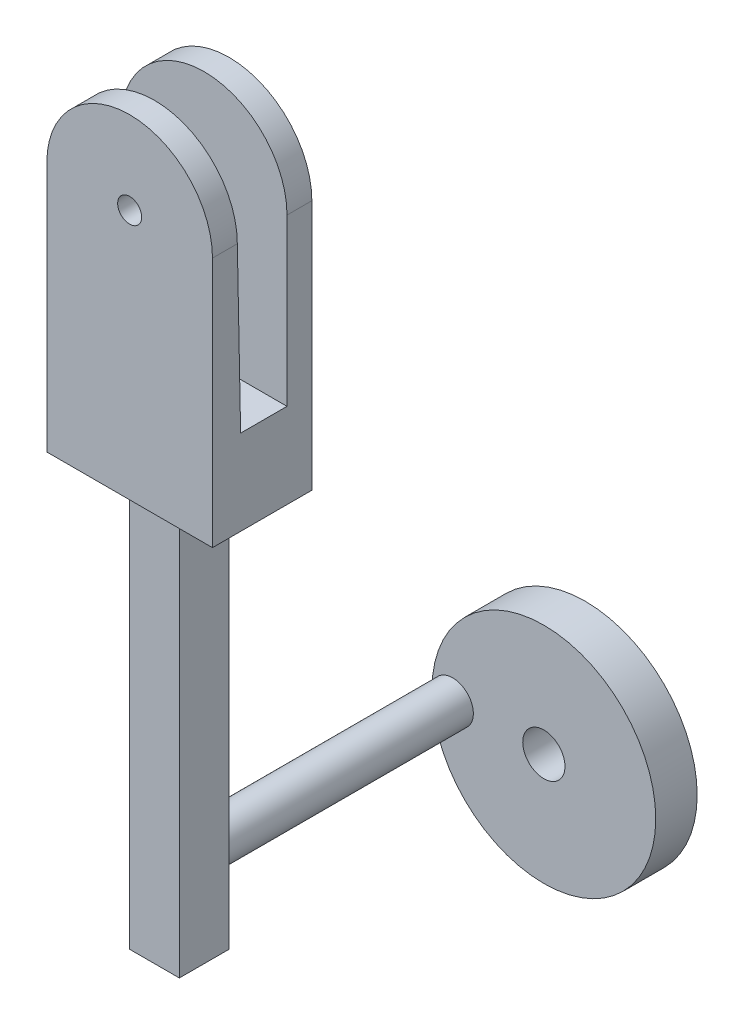
ISO-10303-21;
HEADER;
FILE_DESCRIPTION(('STEP AP214'),'2;1');
FILE_NAME('part.step','',(''),(''),'','','');
FILE_SCHEMA(('AUTOMOTIVE_DESIGN { 1 0 10303 214 1 1 1 1 }'));
ENDSEC;
DATA;
#1=APPLICATION_CONTEXT('core data for automotive mechanical design processes');
#2=APPLICATION_PROTOCOL_DEFINITION('international standard','automotive_design',2000,#1);
#3=PRODUCT_CONTEXT('',#1,'mechanical');
#4=PRODUCT('Part','Part','',(#3));
#5=PRODUCT_RELATED_PRODUCT_CATEGORY('part','',(#4));
#6=PRODUCT_DEFINITION_FORMATION('','',#4);
#7=PRODUCT_DEFINITION_CONTEXT('part definition',#1,'design');
#8=PRODUCT_DEFINITION('design','',#6,#7);
#9=PRODUCT_DEFINITION_SHAPE('','',#8);
#10=(LENGTH_UNIT() NAMED_UNIT(*) SI_UNIT(.MILLI.,.METRE.));
#11=(NAMED_UNIT(*) PLANE_ANGLE_UNIT() SI_UNIT($,.RADIAN.));
#12=(NAMED_UNIT(*) SI_UNIT($,.STERADIAN.) SOLID_ANGLE_UNIT());
#13=UNCERTAINTY_MEASURE_WITH_UNIT(LENGTH_MEASURE(1.E-05),#10,'distance_accuracy_value','');
#14=(GEOMETRIC_REPRESENTATION_CONTEXT(3) GLOBAL_UNCERTAINTY_ASSIGNED_CONTEXT((#13)) GLOBAL_UNIT_ASSIGNED_CONTEXT((#10,
#11,#12)) REPRESENTATION_CONTEXT('',''));
#15=CARTESIAN_POINT('',(0.,0.,0.));
#16=DIRECTION('',(0.,0.,1.));
#17=DIRECTION('',(1.,0.,0.));
#18=AXIS2_PLACEMENT_3D('',#15,#16,#17);
#19=CARTESIAN_POINT('',(0.,-30.2764175480678,12.));
#20=DIRECTION('',(0.,1.,0.));
#21=DIRECTION('',(0.,0.,1.));
#22=AXIS2_PLACEMENT_3D('',#19,#20,#21);
#23=PLANE('',#22);
#24=DIRECTION('',(1.,0.,0.));
#25=VECTOR('',#24,1.);
#26=CARTESIAN_POINT('',(0.,-30.2764175480678,0.));
#27=LINE('',#26,#25);
#28=CARTESIAN_POINT('',(-10.,-30.2764175480678,0.));
#29=VERTEX_POINT('',#28);
#30=CARTESIAN_POINT('',(10.,-30.2764175480678,0.));
#31=VERTEX_POINT('',#30);
#32=EDGE_CURVE('E212',#29,#31,#27,.T.);
#33=ORIENTED_EDGE('',*,*,#32,.T.);
#34=DIRECTION('',(0.,0.,-1.));
#35=VECTOR('',#34,1.);
#36=CARTESIAN_POINT('',(10.,-30.2764175480678,12.));
#37=LINE('',#36,#35);
#38=CARTESIAN_POINT('',(10.,-30.2764175480678,12.));
#39=VERTEX_POINT('',#38);
#40=EDGE_CURVE('E221',#39,#31,#37,.T.);
#41=ORIENTED_EDGE('',*,*,#40,.F.);
#42=DIRECTION('',(1.,0.,0.));
#43=VECTOR('',#42,1.);
#44=CARTESIAN_POINT('',(0.,-30.2764175480678,12.));
#45=LINE('',#44,#43);
#46=CARTESIAN_POINT('',(-10.,-30.2764175480678,12.));
#47=VERTEX_POINT('',#46);
#48=EDGE_CURVE('E219',#47,#39,#45,.T.);
#49=ORIENTED_EDGE('',*,*,#48,.F.);
#50=DIRECTION('',(0.,0.,-1.));
#51=VECTOR('',#50,1.);
#52=CARTESIAN_POINT('',(-10.,-30.2764175480678,12.));
#53=LINE('',#52,#51);
#54=EDGE_CURVE('E235',#47,#29,#53,.T.);
#55=ORIENTED_EDGE('',*,*,#54,.T.);
#56=EDGE_LOOP('',(#33,#41,#49,#55));
#57=FACE_BOUND('',#56,.T.);
#58=DIRECTION('',(-1.,0.,0.));
#59=VECTOR('',#58,1.);
#60=CARTESIAN_POINT('',(3.,-30.2764175480678,9.));
#61=LINE('',#60,#59);
#62=CARTESIAN_POINT('',(3.,-30.2764175480678,9.));
#63=VERTEX_POINT('',#62);
#64=CARTESIAN_POINT('',(-3.,-30.2764175480678,9.));
#65=VERTEX_POINT('',#64);
#66=EDGE_CURVE('E53',#63,#65,#61,.T.);
#67=ORIENTED_EDGE('',*,*,#66,.F.);
#68=DIRECTION('',(0.,0.,-1.));
#69=VECTOR('',#68,1.);
#70=CARTESIAN_POINT('',(3.,-30.2764175480678,9.));
#71=LINE('',#70,#69);
#72=CARTESIAN_POINT('',(3.,-30.2764175480678,3.));
#73=VERTEX_POINT('',#72);
#74=EDGE_CURVE('E58',#63,#73,#71,.T.);
#75=ORIENTED_EDGE('',*,*,#74,.T.);
#76=DIRECTION('',(-1.,0.,0.));
#77=VECTOR('',#76,1.);
#78=CARTESIAN_POINT('',(3.,-30.2764175480678,3.));
#79=LINE('',#78,#77);
#80=CARTESIAN_POINT('',(-3.,-30.2764175480678,3.));
#81=VERTEX_POINT('',#80);
#82=EDGE_CURVE('E165',#73,#81,#79,.T.);
#83=ORIENTED_EDGE('',*,*,#82,.T.);
#84=DIRECTION('',(0.,0.,-1.));
#85=VECTOR('',#84,1.);
#86=CARTESIAN_POINT('',(-3.,-30.2764175480678,9.));
#87=LINE('',#86,#85);
#88=EDGE_CURVE('E142',#65,#81,#87,.T.);
#89=ORIENTED_EDGE('',*,*,#88,.F.);
#90=EDGE_LOOP('',(#67,#75,#83,#89));
#91=FACE_BOUND('',#90,.T.);
#92=ADVANCED_FACE('F36',(#57,#91),#23,.F.);
#93=CARTESIAN_POINT('',(10.,0.,12.));
#94=DIRECTION('',(-1.,0.,0.));
#95=DIRECTION('',(0.,-1.,0.));
#96=AXIS2_PLACEMENT_3D('',#93,#94,#95);
#97=PLANE('',#96);
#98=DIRECTION('',(0.,-1.,0.));
#99=VECTOR('',#98,1.);
#100=CARTESIAN_POINT('',(10.,0.,3.));
#101=LINE('',#100,#99);
#102=CARTESIAN_POINT('',(10.,0.,3.));
#103=VERTEX_POINT('',#102);
#104=CARTESIAN_POINT('',(10.,-20.,3.));
#105=VERTEX_POINT('',#104);
#106=EDGE_CURVE('E177',#103,#105,#101,.T.);
#107=ORIENTED_EDGE('',*,*,#106,.T.);
#108=DIRECTION('',(0.,0.,-1.));
#109=VECTOR('',#108,1.);
#110=CARTESIAN_POINT('',(10.,-20.,0.));
#111=LINE('',#110,#109);
#112=CARTESIAN_POINT('',(10.,-20.,8.60053372982809));
#113=VERTEX_POINT('',#112);
#114=EDGE_CURVE('E181',#113,#105,#111,.T.);
#115=ORIENTED_EDGE('',*,*,#114,.F.);
#116=DIRECTION('',(0.,-0.999800593034313,-0.0199693306907542));
#117=VECTOR('',#116,1.);
#118=CARTESIAN_POINT('',(10.,-0.179688138004029,8.99641103248587));
#119=LINE('',#118,#117);
#120=CARTESIAN_POINT('',(10.,0.,9.));
#121=VERTEX_POINT('',#120);
#122=EDGE_CURVE('E190',#121,#113,#119,.T.);
#123=ORIENTED_EDGE('',*,*,#122,.F.);
#124=DIRECTION('',(0.,0.,-1.));
#125=VECTOR('',#124,1.);
#126=CARTESIAN_POINT('',(10.,0.,12.));
#127=LINE('',#126,#125);
#128=CARTESIAN_POINT('',(10.,0.,12.));
#129=VERTEX_POINT('',#128);
#130=EDGE_CURVE('E243',#129,#121,#127,.T.);
#131=ORIENTED_EDGE('',*,*,#130,.F.);
#132=DIRECTION('',(0.,1.,0.));
#133=VECTOR('',#132,1.);
#134=CARTESIAN_POINT('',(10.,0.,12.));
#135=LINE('',#134,#133);
#136=EDGE_CURVE('E211',#39,#129,#135,.T.);
#137=ORIENTED_EDGE('',*,*,#136,.F.);
#138=ORIENTED_EDGE('',*,*,#40,.T.);
#139=DIRECTION('',(0.,1.,0.));
#140=VECTOR('',#139,1.);
#141=CARTESIAN_POINT('',(10.,0.,0.));
#142=LINE('',#141,#140);
#143=CARTESIAN_POINT('',(10.,0.,0.));
#144=VERTEX_POINT('',#143);
#145=EDGE_CURVE('E224',#31,#144,#142,.T.);
#146=ORIENTED_EDGE('',*,*,#145,.T.);
#147=EDGE_CURVE('E242',#103,#144,#127,.T.);
#148=ORIENTED_EDGE('',*,*,#147,.F.);
#149=EDGE_LOOP('',(#107,#115,#123,#131,#137,#138,#146,#148));
#150=FACE_BOUND('',#149,.T.);
#151=ADVANCED_FACE('F295',(#150),#97,.F.);
#152=CARTESIAN_POINT('',(0.,0.,12.));
#153=DIRECTION('',(0.,0.,-1.));
#154=DIRECTION('',(-1.,0.,0.));
#155=AXIS2_PLACEMENT_3D('',#152,#153,#154);
#156=CYLINDRICAL_SURFACE('',#155,10.);
#157=CARTESIAN_POINT('',(0.,0.,3.));
#158=DIRECTION('',(0.,0.,1.));
#159=DIRECTION('',(1.,0.,0.));
#160=AXIS2_PLACEMENT_3D('',#157,#158,#159);
#161=CIRCLE('',#160,10.);
#162=CARTESIAN_POINT('',(-10.,0.,3.));
#163=VERTEX_POINT('',#162);
#164=EDGE_CURVE('E205',#103,#163,#161,.T.);
#165=ORIENTED_EDGE('',*,*,#164,.F.);
#166=ORIENTED_EDGE('',*,*,#147,.T.);
#167=CARTESIAN_POINT('',(0.,0.,0.));
#168=DIRECTION('',(0.,0.,1.));
#169=DIRECTION('',(1.,0.,0.));
#170=AXIS2_PLACEMENT_3D('',#167,#168,#169);
#171=CIRCLE('',#170,10.);
#172=CARTESIAN_POINT('',(-10.,0.,0.));
#173=VERTEX_POINT('',#172);
#174=EDGE_CURVE('E227',#144,#173,#171,.T.);
#175=ORIENTED_EDGE('',*,*,#174,.T.);
#176=DIRECTION('',(0.,0.,-1.));
#177=VECTOR('',#176,1.);
#178=CARTESIAN_POINT('',(-10.,0.,12.));
#179=LINE('',#178,#177);
#180=EDGE_CURVE('E238',#163,#173,#179,.T.);
#181=ORIENTED_EDGE('',*,*,#180,.F.);
#182=EDGE_LOOP('',(#165,#166,#175,#181));
#183=FACE_BOUND('',#182,.T.);
#184=ADVANCED_FACE('F266',(#183),#156,.T.);
#185=CARTESIAN_POINT('',(0.,0.,9.));
#186=DIRECTION('',(0.,0.,-1.));
#187=DIRECTION('',(-1.,0.,0.));
#188=AXIS2_PLACEMENT_3D('',#185,#186,#187);
#189=CIRCLE('',#188,10.);
#190=CARTESIAN_POINT('',(-10.,0.,9.));
#191=VERTEX_POINT('',#190);
#192=EDGE_CURVE('E197',#191,#121,#189,.T.);
#193=ORIENTED_EDGE('',*,*,#192,.F.);
#194=CARTESIAN_POINT('',(-10.,0.,12.));
#195=VERTEX_POINT('',#194);
#196=EDGE_CURVE('E239',#195,#191,#179,.T.);
#197=ORIENTED_EDGE('',*,*,#196,.F.);
#198=CARTESIAN_POINT('',(0.,0.,12.));
#199=DIRECTION('',(0.,0.,1.));
#200=DIRECTION('',(1.,0.,0.));
#201=AXIS2_PLACEMENT_3D('',#198,#199,#200);
#202=CIRCLE('',#201,10.);
#203=EDGE_CURVE('E215',#129,#195,#202,.T.);
#204=ORIENTED_EDGE('',*,*,#203,.F.);
#205=ORIENTED_EDGE('',*,*,#130,.T.);
#206=EDGE_LOOP('',(#193,#197,#204,#205));
#207=FACE_BOUND('',#206,.T.);
#208=ADVANCED_FACE('F285',(#207),#156,.T.);
#209=CARTESIAN_POINT('',(-10.,0.,12.));
#210=DIRECTION('',(1.,0.,0.));
#211=DIRECTION('',(0.,1.,0.));
#212=AXIS2_PLACEMENT_3D('',#209,#210,#211);
#213=PLANE('',#212);
#214=DIRECTION('',(0.,-1.,0.));
#215=VECTOR('',#214,1.);
#216=CARTESIAN_POINT('',(-10.,0.,3.));
#217=LINE('',#216,#215);
#218=CARTESIAN_POINT('',(-10.,-20.,3.));
#219=VERTEX_POINT('',#218);
#220=EDGE_CURVE('E178',#163,#219,#217,.T.);
#221=ORIENTED_EDGE('',*,*,#220,.F.);
#222=ORIENTED_EDGE('',*,*,#180,.T.);
#223=DIRECTION('',(0.,-1.,0.));
#224=VECTOR('',#223,1.);
#225=CARTESIAN_POINT('',(-10.,0.,0.));
#226=LINE('',#225,#224);
#227=EDGE_CURVE('E230',#173,#29,#226,.T.);
#228=ORIENTED_EDGE('',*,*,#227,.T.);
#229=ORIENTED_EDGE('',*,*,#54,.F.);
#230=DIRECTION('',(0.,-1.,0.));
#231=VECTOR('',#230,1.);
#232=CARTESIAN_POINT('',(-10.,0.,12.));
#233=LINE('',#232,#231);
#234=EDGE_CURVE('E217',#195,#47,#233,.T.);
#235=ORIENTED_EDGE('',*,*,#234,.F.);
#236=ORIENTED_EDGE('',*,*,#196,.T.);
#237=DIRECTION('',(0.,-0.999800593034313,-0.0199693306907542));
#238=VECTOR('',#237,1.);
#239=CARTESIAN_POINT('',(-10.,-0.179688138004029,8.99641103248587));
#240=LINE('',#239,#238);
#241=CARTESIAN_POINT('',(-10.,-20.,8.60053372982809));
#242=VERTEX_POINT('',#241);
#243=EDGE_CURVE('E180',#191,#242,#240,.T.);
#244=ORIENTED_EDGE('',*,*,#243,.T.);
#245=DIRECTION('',(0.,0.,-1.));
#246=VECTOR('',#245,1.);
#247=CARTESIAN_POINT('',(-10.,-20.,0.));
#248=LINE('',#247,#246);
#249=EDGE_CURVE('E184',#242,#219,#248,.T.);
#250=ORIENTED_EDGE('',*,*,#249,.T.);
#251=EDGE_LOOP('',(#221,#222,#228,#229,#235,#236,#244,#250));
#252=FACE_BOUND('',#251,.T.);
#253=ADVANCED_FACE('F265',(#252),#213,.F.);
#254=CARTESIAN_POINT('',(0.,0.,12.));
#255=DIRECTION('',(0.,0.,-1.));
#256=DIRECTION('',(-1.,0.,0.));
#257=AXIS2_PLACEMENT_3D('',#254,#255,#256);
#258=CYLINDRICAL_SURFACE('',#257,1.45);
#259=CARTESIAN_POINT('',(0.,0.,0.));
#260=DIRECTION('',(0.,0.,1.));
#261=DIRECTION('',(1.,0.,0.));
#262=AXIS2_PLACEMENT_3D('',#259,#260,#261);
#263=CIRCLE('',#262,1.45);
#264=CARTESIAN_POINT('',(1.45,0.,0.));
#265=VERTEX_POINT('',#264);
#266=EDGE_CURVE('E207',#265,#265,#263,.T.);
#267=ORIENTED_EDGE('',*,*,#266,.F.);
#268=EDGE_LOOP('',(#267));
#269=FACE_BOUND('',#268,.T.);
#270=CARTESIAN_POINT('',(0.,0.,3.));
#271=DIRECTION('',(0.,0.,1.));
#272=DIRECTION('',(1.,0.,0.));
#273=AXIS2_PLACEMENT_3D('',#270,#271,#272);
#274=CIRCLE('',#273,1.45);
#275=CARTESIAN_POINT('',(1.45,0.,3.));
#276=VERTEX_POINT('',#275);
#277=EDGE_CURVE('E204',#276,#276,#274,.T.);
#278=ORIENTED_EDGE('',*,*,#277,.T.);
#279=EDGE_LOOP('',(#278));
#280=FACE_BOUND('',#279,.T.);
#281=ADVANCED_FACE('F250',(#269,#280),#258,.F.);
#282=CARTESIAN_POINT('',(0.,0.,9.));
#283=DIRECTION('',(0.,-0.0199693306907542,0.999800593034313));
#284=DIRECTION('',(0.,-0.999800593034313,-0.0199693306907542));
#285=AXIS2_PLACEMENT_3D('',#282,#283,#284);
#286=ELLIPSE('',#285,1.4502891977683,1.45);
#287=CARTESIAN_POINT('',(-1.45,0.,9.));
#288=VERTEX_POINT('',#287);
#289=CARTESIAN_POINT('',(1.45,0.,9.));
#290=VERTEX_POINT('',#289);
#291=EDGE_CURVE('E11',#288,#290,#286,.T.);
#292=ORIENTED_EDGE('',*,*,#291,.F.);
#293=CARTESIAN_POINT('',(0.,0.,9.));
#294=DIRECTION('',(0.,0.,-1.));
#295=DIRECTION('',(-1.,0.,0.));
#296=AXIS2_PLACEMENT_3D('',#293,#294,#295);
#297=CIRCLE('',#296,1.45);
#298=EDGE_CURVE('E45',#288,#290,#297,.T.);
#299=ORIENTED_EDGE('',*,*,#298,.T.);
#300=EDGE_LOOP('',(#292,#299));
#301=FACE_BOUND('',#300,.T.);
#302=CARTESIAN_POINT('',(0.,0.,12.));
#303=DIRECTION('',(0.,0.,1.));
#304=DIRECTION('',(1.,0.,0.));
#305=AXIS2_PLACEMENT_3D('',#302,#303,#304);
#306=CIRCLE('',#305,1.45);
#307=CARTESIAN_POINT('',(1.45,0.,12.));
#308=VERTEX_POINT('',#307);
#309=EDGE_CURVE('E208',#308,#308,#306,.T.);
#310=ORIENTED_EDGE('',*,*,#309,.T.);
#311=EDGE_LOOP('',(#310));
#312=FACE_BOUND('',#311,.T.);
#313=ADVANCED_FACE('F38',(#301,#312),#258,.F.);
#314=CARTESIAN_POINT('',(0.,0.,12.));
#315=DIRECTION('',(0.,0.,1.));
#316=DIRECTION('',(1.,0.,0.));
#317=AXIS2_PLACEMENT_3D('',#314,#315,#316);
#318=PLANE('',#317);
#319=ORIENTED_EDGE('',*,*,#309,.F.);
#320=EDGE_LOOP('',(#319));
#321=FACE_BOUND('',#320,.T.);
#322=ORIENTED_EDGE('',*,*,#136,.T.);
#323=ORIENTED_EDGE('',*,*,#203,.T.);
#324=ORIENTED_EDGE('',*,*,#234,.T.);
#325=ORIENTED_EDGE('',*,*,#48,.T.);
#326=EDGE_LOOP('',(#322,#323,#324,#325));
#327=FACE_BOUND('',#326,.T.);
#328=ADVANCED_FACE('F279',(#321,#327),#318,.T.);
#329=CARTESIAN_POINT('',(0.,0.,0.));
#330=DIRECTION('',(0.,0.,1.));
#331=DIRECTION('',(1.,0.,0.));
#332=AXIS2_PLACEMENT_3D('',#329,#330,#331);
#333=PLANE('',#332);
#334=ORIENTED_EDGE('',*,*,#266,.T.);
#335=EDGE_LOOP('',(#334));
#336=FACE_BOUND('',#335,.T.);
#337=ORIENTED_EDGE('',*,*,#145,.F.);
#338=ORIENTED_EDGE('',*,*,#32,.F.);
#339=ORIENTED_EDGE('',*,*,#227,.F.);
#340=ORIENTED_EDGE('',*,*,#174,.F.);
#341=EDGE_LOOP('',(#337,#338,#339,#340));
#342=FACE_BOUND('',#341,.T.);
#343=ADVANCED_FACE('F256',(#336,#342),#333,.F.);
#344=CARTESIAN_POINT('',(-10.,0.,3.));
#345=DIRECTION('',(0.,0.,1.));
#346=DIRECTION('',(1.,0.,0.));
#347=AXIS2_PLACEMENT_3D('',#344,#345,#346);
#348=PLANE('',#347);
#349=ORIENTED_EDGE('',*,*,#277,.F.);
#350=EDGE_LOOP('',(#349));
#351=FACE_BOUND('',#350,.T.);
#352=ORIENTED_EDGE('',*,*,#164,.T.);
#353=ORIENTED_EDGE('',*,*,#220,.T.);
#354=DIRECTION('',(1.,0.,0.));
#355=VECTOR('',#354,1.);
#356=CARTESIAN_POINT('',(-10.,-20.,3.));
#357=LINE('',#356,#355);
#358=EDGE_CURVE('E195',#219,#105,#357,.T.);
#359=ORIENTED_EDGE('',*,*,#358,.T.);
#360=ORIENTED_EDGE('',*,*,#106,.F.);
#361=EDGE_LOOP('',(#352,#353,#359,#360));
#362=FACE_BOUND('',#361,.T.);
#363=ADVANCED_FACE('F252',(#351,#362),#348,.T.);
#364=CARTESIAN_POINT('',(-10.,0.,9.));
#365=DIRECTION('',(0.,0.,-1.));
#366=DIRECTION('',(-1.,0.,0.));
#367=AXIS2_PLACEMENT_3D('',#364,#365,#366);
#368=PLANE('',#367);
#369=ORIENTED_EDGE('',*,*,#192,.T.);
#370=DIRECTION('',(1.,0.,0.));
#371=VECTOR('',#370,1.);
#372=CARTESIAN_POINT('',(-10.,0.,9.));
#373=LINE('',#372,#371);
#374=EDGE_CURVE('E187',#290,#121,#373,.T.);
#375=ORIENTED_EDGE('',*,*,#374,.F.);
#376=ORIENTED_EDGE('',*,*,#298,.F.);
#377=EDGE_CURVE('E200',#191,#288,#373,.T.);
#378=ORIENTED_EDGE('',*,*,#377,.F.);
#379=EDGE_LOOP('',(#369,#375,#376,#378));
#380=FACE_BOUND('',#379,.T.);
#381=ADVANCED_FACE('F255',(#380),#368,.T.);
#382=CARTESIAN_POINT('',(-10.,-20.,0.));
#383=DIRECTION('',(0.,-1.,0.));
#384=DIRECTION('',(0.,0.,-1.));
#385=AXIS2_PLACEMENT_3D('',#382,#383,#384);
#386=PLANE('',#385);
#387=ORIENTED_EDGE('',*,*,#114,.T.);
#388=ORIENTED_EDGE('',*,*,#358,.F.);
#389=ORIENTED_EDGE('',*,*,#249,.F.);
#390=DIRECTION('',(1.,0.,0.));
#391=VECTOR('',#390,1.);
#392=CARTESIAN_POINT('',(-10.,-20.,8.60053372982809));
#393=LINE('',#392,#391);
#394=EDGE_CURVE('E198',#242,#113,#393,.T.);
#395=ORIENTED_EDGE('',*,*,#394,.T.);
#396=EDGE_LOOP('',(#387,#388,#389,#395));
#397=FACE_BOUND('',#396,.T.);
#398=ADVANCED_FACE('F297',(#397),#386,.F.);
#399=CARTESIAN_POINT('',(-10.,-0.179688138004029,8.99641103248587));
#400=DIRECTION('',(0.,-0.0199693306907542,0.999800593034313));
#401=DIRECTION('',(0.,-0.999800593034313,-0.0199693306907542));
#402=AXIS2_PLACEMENT_3D('',#399,#400,#401);
#403=PLANE('',#402);
#404=ORIENTED_EDGE('',*,*,#291,.T.);
#405=ORIENTED_EDGE('',*,*,#374,.T.);
#406=ORIENTED_EDGE('',*,*,#122,.T.);
#407=ORIENTED_EDGE('',*,*,#394,.F.);
#408=ORIENTED_EDGE('',*,*,#243,.F.);
#409=ORIENTED_EDGE('',*,*,#377,.T.);
#410=EDGE_LOOP('',(#404,#405,#406,#407,#408,#409));
#411=FACE_BOUND('',#410,.T.);
#412=ADVANCED_FACE('F290',(#411),#403,.F.);
#413=CARTESIAN_POINT('',(3.,-80.2764175480678,9.));
#414=DIRECTION('',(0.,0.,-1.));
#415=DIRECTION('',(-1.,0.,0.));
#416=AXIS2_PLACEMENT_3D('',#413,#414,#415);
#417=PLANE('',#416);
#418=ORIENTED_EDGE('',*,*,#66,.T.);
#419=DIRECTION('',(0.,1.,0.));
#420=VECTOR('',#419,1.);
#421=CARTESIAN_POINT('',(-3.,-80.2764175480678,9.));
#422=LINE('',#421,#420);
#423=CARTESIAN_POINT('',(-3.,-80.2764175480678,9.));
#424=VERTEX_POINT('',#423);
#425=EDGE_CURVE('E174',#424,#65,#422,.T.);
#426=ORIENTED_EDGE('',*,*,#425,.F.);
#427=DIRECTION('',(-1.,0.,0.));
#428=VECTOR('',#427,1.);
#429=CARTESIAN_POINT('',(3.,-80.2764175480678,9.));
#430=LINE('',#429,#428);
#431=CARTESIAN_POINT('',(3.,-80.2764175480678,9.));
#432=VERTEX_POINT('',#431);
#433=EDGE_CURVE('E151',#432,#424,#430,.T.);
#434=ORIENTED_EDGE('',*,*,#433,.F.);
#435=DIRECTION('',(0.,1.,0.));
#436=VECTOR('',#435,1.);
#437=CARTESIAN_POINT('',(3.,-80.2764175480678,9.));
#438=LINE('',#437,#436);
#439=EDGE_CURVE('E161',#432,#63,#438,.T.);
#440=ORIENTED_EDGE('',*,*,#439,.T.);
#441=EDGE_LOOP('',(#418,#426,#434,#440));
#442=FACE_BOUND('',#441,.T.);
#443=ADVANCED_FACE('F370',(#442),#417,.F.);
#444=CARTESIAN_POINT('',(-3.,-80.2764175480678,9.));
#445=DIRECTION('',(1.,0.,0.));
#446=DIRECTION('',(0.,0.,-1.));
#447=AXIS2_PLACEMENT_3D('',#444,#445,#446);
#448=PLANE('',#447);
#449=ORIENTED_EDGE('',*,*,#88,.T.);
#450=DIRECTION('',(0.,1.,0.));
#451=VECTOR('',#450,1.);
#452=CARTESIAN_POINT('',(-3.,-80.2764175480678,3.));
#453=LINE('',#452,#451);
#454=CARTESIAN_POINT('',(-3.,-80.2764175480678,3.));
#455=VERTEX_POINT('',#454);
#456=EDGE_CURVE('E171',#455,#81,#453,.T.);
#457=ORIENTED_EDGE('',*,*,#456,.F.);
#458=DIRECTION('',(0.,0.,-1.));
#459=VECTOR('',#458,1.);
#460=CARTESIAN_POINT('',(-3.,-80.2764175480678,9.));
#461=LINE('',#460,#459);
#462=EDGE_CURVE('E154',#424,#455,#461,.T.);
#463=ORIENTED_EDGE('',*,*,#462,.F.);
#464=ORIENTED_EDGE('',*,*,#425,.T.);
#465=EDGE_LOOP('',(#449,#457,#463,#464));
#466=FACE_BOUND('',#465,.T.);
#467=ADVANCED_FACE('F384',(#466),#448,.F.);
#468=CARTESIAN_POINT('',(3.,-80.2764175480678,3.));
#469=DIRECTION('',(0.,0.,-1.));
#470=DIRECTION('',(-1.,0.,0.));
#471=AXIS2_PLACEMENT_3D('',#468,#469,#470);
#472=PLANE('',#471);
#473=CARTESIAN_POINT('',(0.,-70.8820008985873,3.));
#474=DIRECTION('',(0.,0.,-1.));
#475=DIRECTION('',(-1.,0.,0.));
#476=AXIS2_PLACEMENT_3D('',#473,#474,#475);
#477=CIRCLE('',#476,2.5);
#478=CARTESIAN_POINT('',(-2.5,-70.8820008985873,3.));
#479=VERTEX_POINT('',#478);
#480=EDGE_CURVE('E140',#479,#479,#477,.T.);
#481=ORIENTED_EDGE('',*,*,#480,.F.);
#482=EDGE_LOOP('',(#481));
#483=FACE_BOUND('',#482,.T.);
#484=ORIENTED_EDGE('',*,*,#82,.F.);
#485=DIRECTION('',(0.,1.,0.));
#486=VECTOR('',#485,1.);
#487=CARTESIAN_POINT('',(3.,-80.2764175480678,3.));
#488=LINE('',#487,#486);
#489=CARTESIAN_POINT('',(3.,-80.2764175480678,3.));
#490=VERTEX_POINT('',#489);
#491=EDGE_CURVE('E169',#490,#73,#488,.T.);
#492=ORIENTED_EDGE('',*,*,#491,.F.);
#493=DIRECTION('',(-1.,0.,0.));
#494=VECTOR('',#493,1.);
#495=CARTESIAN_POINT('',(3.,-80.2764175480678,3.));
#496=LINE('',#495,#494);
#497=EDGE_CURVE('E156',#490,#455,#496,.T.);
#498=ORIENTED_EDGE('',*,*,#497,.T.);
#499=ORIENTED_EDGE('',*,*,#456,.T.);
#500=EDGE_LOOP('',(#484,#492,#498,#499));
#501=FACE_BOUND('',#500,.T.);
#502=ADVANCED_FACE('F394',(#483,#501),#472,.T.);
#503=CARTESIAN_POINT('',(3.,-80.2764175480678,9.));
#504=DIRECTION('',(1.,0.,0.));
#505=DIRECTION('',(0.,0.,-1.));
#506=AXIS2_PLACEMENT_3D('',#503,#504,#505);
#507=PLANE('',#506);
#508=ORIENTED_EDGE('',*,*,#74,.F.);
#509=ORIENTED_EDGE('',*,*,#439,.F.);
#510=DIRECTION('',(0.,0.,-1.));
#511=VECTOR('',#510,1.);
#512=CARTESIAN_POINT('',(3.,-80.2764175480678,9.));
#513=LINE('',#512,#511);
#514=EDGE_CURVE('E159',#432,#490,#513,.T.);
#515=ORIENTED_EDGE('',*,*,#514,.T.);
#516=ORIENTED_EDGE('',*,*,#491,.T.);
#517=EDGE_LOOP('',(#508,#509,#515,#516));
#518=FACE_BOUND('',#517,.T.);
#519=ADVANCED_FACE('F402',(#518),#507,.T.);
#520=CARTESIAN_POINT('',(0.,-80.2764175480678,0.));
#521=DIRECTION('',(0.,-1.,0.));
#522=DIRECTION('',(0.,0.,-1.));
#523=AXIS2_PLACEMENT_3D('',#520,#521,#522);
#524=PLANE('',#523);
#525=ORIENTED_EDGE('',*,*,#433,.T.);
#526=ORIENTED_EDGE('',*,*,#462,.T.);
#527=ORIENTED_EDGE('',*,*,#497,.F.);
#528=ORIENTED_EDGE('',*,*,#514,.F.);
#529=EDGE_LOOP('',(#525,#526,#527,#528));
#530=FACE_BOUND('',#529,.T.);
#531=ADVANCED_FACE('F407',(#530),#524,.T.);
#532=CARTESIAN_POINT('',(0.,-70.8820008985873,-27.));
#533=DIRECTION('',(0.,0.,1.));
#534=DIRECTION('',(1.,0.,0.));
#535=AXIS2_PLACEMENT_3D('',#532,#533,#534);
#536=CYLINDRICAL_SURFACE('',#535,2.5);
#537=CARTESIAN_POINT('',(0.,-70.8820008985873,-27.));
#538=DIRECTION('',(0.,0.,-1.));
#539=DIRECTION('',(-1.,0.,0.));
#540=AXIS2_PLACEMENT_3D('',#537,#538,#539);
#541=CIRCLE('',#540,2.5);
#542=CARTESIAN_POINT('',(-2.49999999999999,-70.8820008985873,-27.));
#543=VERTEX_POINT('',#542);
#544=EDGE_CURVE('E134',#543,#543,#541,.T.);
#545=ORIENTED_EDGE('',*,*,#544,.F.);
#546=EDGE_LOOP('',(#545));
#547=FACE_BOUND('',#546,.T.);
#548=ORIENTED_EDGE('',*,*,#480,.T.);
#549=EDGE_LOOP('',(#548));
#550=FACE_BOUND('',#549,.T.);
#551=ADVANCED_FACE('F135',(#547,#550),#536,.T.);
#552=CARTESIAN_POINT('',(11.0110174505917,-70.8820008985873,-32.));
#553=DIRECTION('',(0.,0.,1.));
#554=DIRECTION('',(1.,0.,0.));
#555=AXIS2_PLACEMENT_3D('',#552,#553,#554);
#556=CYLINDRICAL_SURFACE('',#555,13.5110174505917);
#557=CARTESIAN_POINT('',(11.0110174505917,-70.8820008985873,-32.));
#558=DIRECTION('',(0.,0.,-1.));
#559=DIRECTION('',(-1.,0.,0.));
#560=AXIS2_PLACEMENT_3D('',#557,#558,#559);
#561=CIRCLE('',#560,13.5110174505917);
#562=CARTESIAN_POINT('',(-2.49999999999999,-70.8820008985873,-32.));
#563=VERTEX_POINT('',#562);
#564=EDGE_CURVE('E145',#563,#563,#561,.T.);
#565=ORIENTED_EDGE('',*,*,#564,.F.);
#566=EDGE_LOOP('',(#565));
#567=FACE_BOUND('',#566,.T.);
#568=CARTESIAN_POINT('',(11.0110174505917,-70.8820008985873,-27.));
#569=DIRECTION('',(0.,0.,-1.));
#570=DIRECTION('',(-1.,0.,0.));
#571=AXIS2_PLACEMENT_3D('',#568,#569,#570);
#572=CIRCLE('',#571,13.5110174505917);
#573=EDGE_CURVE('E148',#543,#543,#572,.T.);
#574=ORIENTED_EDGE('',*,*,#573,.T.);
#575=EDGE_LOOP('',(#574));
#576=FACE_BOUND('',#575,.T.);
#577=ADVANCED_FACE('F433',(#567,#576),#556,.T.);
#578=CARTESIAN_POINT('',(0.,0.,-32.));
#579=DIRECTION('',(0.,0.,-1.));
#580=DIRECTION('',(-1.,0.,0.));
#581=AXIS2_PLACEMENT_3D('',#578,#579,#580);
#582=PLANE('',#581);
#583=CARTESIAN_POINT('',(11.0110174505917,-70.8820008985873,-32.));
#584=DIRECTION('',(0.,0.,-1.));
#585=DIRECTION('',(-1.,0.,0.));
#586=AXIS2_PLACEMENT_3D('',#583,#584,#585);
#587=CIRCLE('',#586,2.55);
#588=CARTESIAN_POINT('',(8.46101745059168,-70.8820008985873,-32.));
#589=VERTEX_POINT('',#588);
#590=EDGE_CURVE('E479',#589,#589,#587,.T.);
#591=ORIENTED_EDGE('',*,*,#590,.F.);
#592=EDGE_LOOP('',(#591));
#593=FACE_BOUND('',#592,.T.);
#594=ORIENTED_EDGE('',*,*,#564,.T.);
#595=EDGE_LOOP('',(#594));
#596=FACE_BOUND('',#595,.T.);
#597=ADVANCED_FACE('F442',(#593,#596),#582,.T.);
#598=CARTESIAN_POINT('',(0.,0.,-27.));
#599=DIRECTION('',(0.,0.,-1.));
#600=DIRECTION('',(-1.,0.,0.));
#601=AXIS2_PLACEMENT_3D('',#598,#599,#600);
#602=PLANE('',#601);
#603=CARTESIAN_POINT('',(11.0110174505917,-70.8820008985873,-27.));
#604=DIRECTION('',(0.,0.,-1.));
#605=DIRECTION('',(-1.,0.,0.));
#606=AXIS2_PLACEMENT_3D('',#603,#604,#605);
#607=CIRCLE('',#606,2.55);
#608=CARTESIAN_POINT('',(8.46101745059168,-70.8820008985873,-27.));
#609=VERTEX_POINT('',#608);
#610=EDGE_CURVE('E40',#609,#609,#607,.T.);
#611=ORIENTED_EDGE('',*,*,#610,.T.);
#612=EDGE_LOOP('',(#611));
#613=FACE_BOUND('',#612,.T.);
#614=ORIENTED_EDGE('',*,*,#573,.F.);
#615=ORIENTED_EDGE('',*,*,#544,.T.);
#616=EDGE_LOOP('',(#614,#615));
#617=FACE_BOUND('',#616,.T.);
#618=ADVANCED_FACE('F452',(#613,#617),#602,.F.);
#619=CARTESIAN_POINT('',(11.0110174505917,-70.8820008985873,12.));
#620=DIRECTION('',(0.,0.,-1.));
#621=DIRECTION('',(-1.,0.,0.));
#622=AXIS2_PLACEMENT_3D('',#619,#620,#621);
#623=CYLINDRICAL_SURFACE('',#622,2.55);
#624=ORIENTED_EDGE('',*,*,#590,.T.);
#625=EDGE_LOOP('',(#624));
#626=FACE_BOUND('',#625,.T.);
#627=ORIENTED_EDGE('',*,*,#610,.F.);
#628=EDGE_LOOP('',(#627));
#629=FACE_BOUND('',#628,.T.);
#630=ADVANCED_FACE('F462',(#626,#629),#623,.F.);
#631=CLOSED_SHELL('',(#92,#151,#184,#208,#253,#281,#313,#328,#343,#363,#381,#398,#412,#443,#467,
#502,#519,#531,#551,#577,#597,#618,#630));
#632=MANIFOLD_SOLID_BREP('B2',#631);
#633=ADVANCED_BREP_SHAPE_REPRESENTATION('',(#18,#632),#14);
#634=SHAPE_DEFINITION_REPRESENTATION(#9,#633);
ENDSEC;
END-ISO-10303-21;
